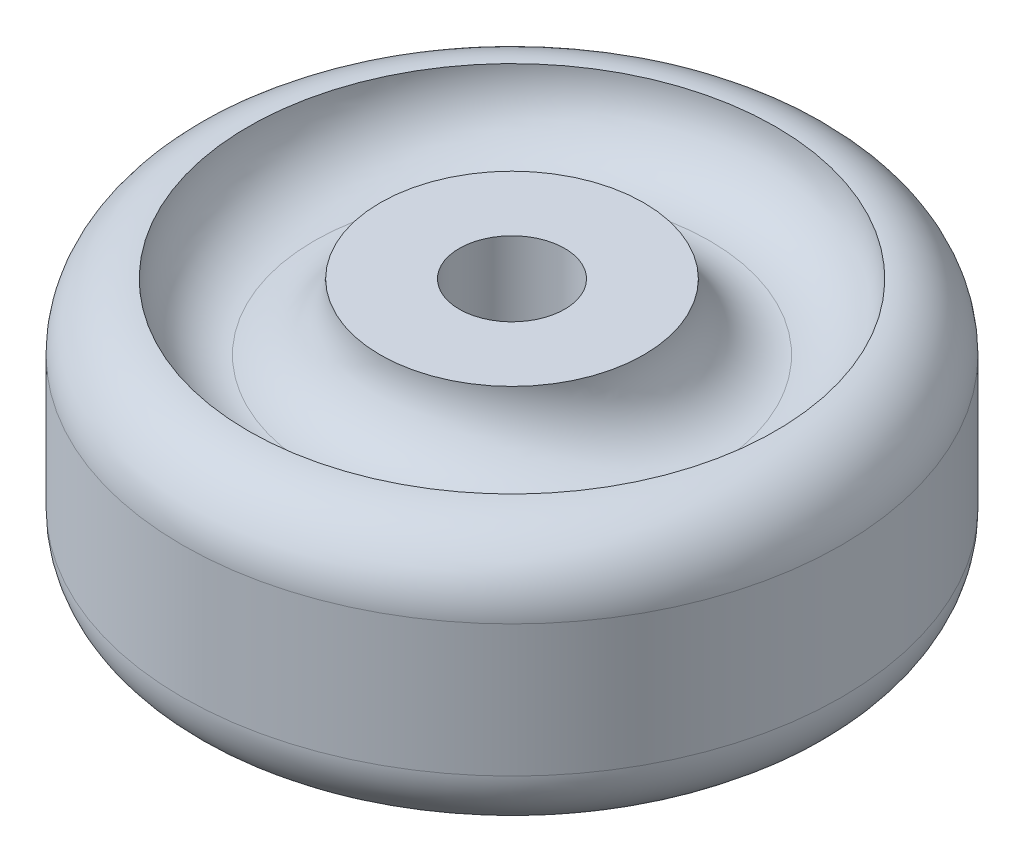
ISO-10303-21;
HEADER;
FILE_DESCRIPTION(('STEP AP214'),'2;1');
FILE_NAME('part.step','',(''),(''),'','','');
FILE_SCHEMA(('AUTOMOTIVE_DESIGN { 1 0 10303 214 1 1 1 1 }'));
ENDSEC;
DATA;
#1=APPLICATION_CONTEXT('core data for automotive mechanical design processes');
#2=APPLICATION_PROTOCOL_DEFINITION('international standard','automotive_design',2000,#1);
#3=PRODUCT_CONTEXT('',#1,'mechanical');
#4=PRODUCT('Part','Part','',(#3));
#5=PRODUCT_RELATED_PRODUCT_CATEGORY('part','',(#4));
#6=PRODUCT_DEFINITION_FORMATION('','',#4);
#7=PRODUCT_DEFINITION_CONTEXT('part definition',#1,'design');
#8=PRODUCT_DEFINITION('design','',#6,#7);
#9=PRODUCT_DEFINITION_SHAPE('','',#8);
#10=(LENGTH_UNIT() NAMED_UNIT(*) SI_UNIT(.MILLI.,.METRE.));
#11=(NAMED_UNIT(*) PLANE_ANGLE_UNIT() SI_UNIT($,.RADIAN.));
#12=(NAMED_UNIT(*) SI_UNIT($,.STERADIAN.) SOLID_ANGLE_UNIT());
#13=UNCERTAINTY_MEASURE_WITH_UNIT(LENGTH_MEASURE(1.E-05),#10,'distance_accuracy_value','');
#14=(GEOMETRIC_REPRESENTATION_CONTEXT(3) GLOBAL_UNCERTAINTY_ASSIGNED_CONTEXT((#13)) GLOBAL_UNIT_ASSIGNED_CONTEXT((#10,
#11,#12)) REPRESENTATION_CONTEXT('',''));
#15=CARTESIAN_POINT('',(0.,0.,0.));
#16=DIRECTION('',(0.,0.,1.));
#17=DIRECTION('',(1.,0.,0.));
#18=AXIS2_PLACEMENT_3D('',#15,#16,#17);
#19=CARTESIAN_POINT('',(0.,10.,0.));
#20=DIRECTION('',(0.,-1.,0.));
#21=DIRECTION('',(0.,0.,-1.));
#22=AXIS2_PLACEMENT_3D('',#19,#20,#21);
#23=CYLINDRICAL_SURFACE('',#22,25.);
#24=CARTESIAN_POINT('',(0.,-5.,0.));
#25=DIRECTION('',(0.,-1.,0.));
#26=DIRECTION('',(0.,0.,-1.));
#27=AXIS2_PLACEMENT_3D('',#24,#25,#26);
#28=CIRCLE('',#27,25.);
#29=CARTESIAN_POINT('',(0.,-5.,-25.));
#30=VERTEX_POINT('',#29);
#31=EDGE_CURVE('E10',#30,#30,#28,.F.);
#32=ORIENTED_EDGE('',*,*,#31,.T.);
#33=EDGE_LOOP('',(#32));
#34=FACE_BOUND('',#33,.T.);
#35=CARTESIAN_POINT('',(0.,5.,0.));
#36=DIRECTION('',(0.,1.,0.));
#37=DIRECTION('',(0.,0.,1.));
#38=AXIS2_PLACEMENT_3D('',#35,#36,#37);
#39=CIRCLE('',#38,25.);
#40=CARTESIAN_POINT('',(0.,5.,25.));
#41=VERTEX_POINT('',#40);
#42=EDGE_CURVE('E43',#41,#41,#39,.F.);
#43=ORIENTED_EDGE('',*,*,#42,.T.);
#44=EDGE_LOOP('',(#43));
#45=FACE_BOUND('',#44,.T.);
#46=ADVANCED_FACE('F36',(#34,#45),#23,.T.);
#47=CARTESIAN_POINT('',(0.,10.,0.));
#48=DIRECTION('',(0.,1.,0.));
#49=DIRECTION('',(0.,0.,1.));
#50=AXIS2_PLACEMENT_3D('',#47,#48,#49);
#51=PLANE('',#50);
#52=CARTESIAN_POINT('',(0.,10.,0.));
#53=DIRECTION('',(0.,1.,0.));
#54=DIRECTION('',(0.,0.,1.));
#55=AXIS2_PLACEMENT_3D('',#52,#53,#54);
#56=CIRCLE('',#55,4.);
#57=CARTESIAN_POINT('',(0.,10.,4.));
#58=VERTEX_POINT('',#57);
#59=EDGE_CURVE('E56',#58,#58,#56,.T.);
#60=ORIENTED_EDGE('',*,*,#59,.F.);
#61=EDGE_LOOP('',(#60));
#62=FACE_BOUND('',#61,.T.);
#63=CARTESIAN_POINT('',(0.,10.,0.));
#64=DIRECTION('',(0.,1.,0.));
#65=DIRECTION('',(0.,0.,1.));
#66=AXIS2_PLACEMENT_3D('',#63,#64,#65);
#67=CIRCLE('',#66,10.);
#68=CARTESIAN_POINT('',(0.,10.,10.));
#69=VERTEX_POINT('',#68);
#70=EDGE_CURVE('E52',#69,#69,#67,.T.);
#71=ORIENTED_EDGE('',*,*,#70,.T.);
#72=EDGE_LOOP('',(#71));
#73=FACE_BOUND('',#72,.T.);
#74=ADVANCED_FACE('F87',(#62,#73),#51,.T.);
#75=CARTESIAN_POINT('',(0.,10.,0.));
#76=DIRECTION('',(0.,1.,0.));
#77=DIRECTION('',(0.,0.,1.));
#78=AXIS2_PLACEMENT_3D('',#75,#76,#77);
#79=TOROIDAL_SURFACE('',#78,15.,5.);
#80=ORIENTED_EDGE('',*,*,#70,.F.);
#81=EDGE_LOOP('',(#80));
#82=FACE_BOUND('',#81,.T.);
#83=CARTESIAN_POINT('',(0.,5.,0.));
#84=DIRECTION('',(0.,1.,0.));
#85=DIRECTION('',(0.,0.,1.));
#86=AXIS2_PLACEMENT_3D('',#83,#84,#85);
#87=CIRCLE('',#86,15.);
#88=CARTESIAN_POINT('',(0.,5.,15.));
#89=VERTEX_POINT('',#88);
#90=EDGE_CURVE('E116',#89,#89,#87,.F.);
#91=ORIENTED_EDGE('',*,*,#90,.F.);
#92=EDGE_LOOP('',(#91));
#93=FACE_BOUND('',#92,.T.);
#94=ADVANCED_FACE('F80',(#82,#93),#79,.F.);
#95=CARTESIAN_POINT('',(0.,10.,0.));
#96=DIRECTION('',(0.,1.,0.));
#97=DIRECTION('',(0.,0.,1.));
#98=AXIS2_PLACEMENT_3D('',#95,#96,#97);
#99=TOROIDAL_SURFACE('',#98,15.,5.);
#100=CARTESIAN_POINT('',(0.,10.,0.));
#101=DIRECTION('',(0.,1.,0.));
#102=DIRECTION('',(0.,0.,1.));
#103=AXIS2_PLACEMENT_3D('',#100,#101,#102);
#104=CIRCLE('',#103,20.);
#105=CARTESIAN_POINT('',(0.,10.,20.));
#106=VERTEX_POINT('',#105);
#107=EDGE_CURVE('E47',#106,#106,#104,.T.);
#108=ORIENTED_EDGE('',*,*,#107,.T.);
#109=EDGE_LOOP('',(#108));
#110=FACE_BOUND('',#109,.T.);
#111=ORIENTED_EDGE('',*,*,#90,.T.);
#112=EDGE_LOOP('',(#111));
#113=FACE_BOUND('',#112,.T.);
#114=ADVANCED_FACE('F71',(#110,#113),#99,.F.);
#115=CARTESIAN_POINT('',(0.,0.,0.));
#116=DIRECTION('',(0.,1.,0.));
#117=DIRECTION('',(0.,0.,1.));
#118=AXIS2_PLACEMENT_3D('',#115,#116,#117);
#119=CYLINDRICAL_SURFACE('',#118,4.);
#120=ORIENTED_EDGE('',*,*,#59,.T.);
#121=EDGE_LOOP('',(#120));
#122=FACE_BOUND('',#121,.T.);
#123=CARTESIAN_POINT('',(0.,-10.,0.));
#124=DIRECTION('',(0.,-1.,0.));
#125=DIRECTION('',(0.,0.,-1.));
#126=AXIS2_PLACEMENT_3D('',#123,#124,#125);
#127=CIRCLE('',#126,4.);
#128=CARTESIAN_POINT('',(0.,-10.,-4.));
#129=VERTEX_POINT('',#128);
#130=EDGE_CURVE('E61',#129,#129,#127,.F.);
#131=ORIENTED_EDGE('',*,*,#130,.F.);
#132=EDGE_LOOP('',(#131));
#133=FACE_BOUND('',#132,.T.);
#134=ADVANCED_FACE('F68',(#122,#133),#119,.F.);
#135=CARTESIAN_POINT('',(0.,5.,0.));
#136=DIRECTION('',(0.,1.,0.));
#137=DIRECTION('',(0.,0.,1.));
#138=AXIS2_PLACEMENT_3D('',#135,#136,#137);
#139=TOROIDAL_SURFACE('',#138,20.,5.);
#140=ORIENTED_EDGE('',*,*,#42,.F.);
#141=EDGE_LOOP('',(#140));
#142=FACE_BOUND('',#141,.T.);
#143=ORIENTED_EDGE('',*,*,#107,.F.);
#144=EDGE_LOOP('',(#143));
#145=FACE_BOUND('',#144,.T.);
#146=ADVANCED_FACE('F70',(#142,#145),#139,.T.);
#147=CARTESIAN_POINT('',(0.,-10.,0.));
#148=DIRECTION('',(0.,-1.,0.));
#149=DIRECTION('',(0.,0.,1.));
#150=AXIS2_PLACEMENT_3D('',#147,#148,#149);
#151=PLANE('',#150);
#152=ORIENTED_EDGE('',*,*,#130,.T.);
#153=EDGE_LOOP('',(#152));
#154=FACE_BOUND('',#153,.T.);
#155=CARTESIAN_POINT('',(0.,-10.,0.));
#156=DIRECTION('',(0.,1.,0.));
#157=DIRECTION('',(0.,0.,1.));
#158=AXIS2_PLACEMENT_3D('',#155,#156,#157);
#159=CIRCLE('',#158,10.);
#160=CARTESIAN_POINT('',(0.,-10.,10.));
#161=VERTEX_POINT('',#160);
#162=EDGE_CURVE('E60',#161,#161,#159,.T.);
#163=ORIENTED_EDGE('',*,*,#162,.F.);
#164=EDGE_LOOP('',(#163));
#165=FACE_BOUND('',#164,.T.);
#166=ADVANCED_FACE('F65',(#154,#165),#151,.T.);
#167=CARTESIAN_POINT('',(0.,-10.,0.));
#168=DIRECTION('',(0.,-1.,0.));
#169=DIRECTION('',(0.,0.,-1.));
#170=AXIS2_PLACEMENT_3D('',#167,#168,#169);
#171=TOROIDAL_SURFACE('',#170,15.,5.);
#172=ORIENTED_EDGE('',*,*,#162,.T.);
#173=EDGE_LOOP('',(#172));
#174=FACE_BOUND('',#173,.T.);
#175=CARTESIAN_POINT('',(0.,-5.,0.));
#176=DIRECTION('',(0.,-1.,0.));
#177=DIRECTION('',(0.,0.,-1.));
#178=AXIS2_PLACEMENT_3D('',#175,#176,#177);
#179=CIRCLE('',#178,15.);
#180=CARTESIAN_POINT('',(0.,-5.,-15.));
#181=VERTEX_POINT('',#180);
#182=EDGE_CURVE('E58',#181,#181,#179,.F.);
#183=ORIENTED_EDGE('',*,*,#182,.F.);
#184=EDGE_LOOP('',(#183));
#185=FACE_BOUND('',#184,.T.);
#186=ADVANCED_FACE('F99',(#174,#185),#171,.F.);
#187=CARTESIAN_POINT('',(0.,-10.,0.));
#188=DIRECTION('',(0.,-1.,0.));
#189=DIRECTION('',(0.,0.,-1.));
#190=AXIS2_PLACEMENT_3D('',#187,#188,#189);
#191=TOROIDAL_SURFACE('',#190,15.,5.);
#192=ORIENTED_EDGE('',*,*,#182,.T.);
#193=EDGE_LOOP('',(#192));
#194=FACE_BOUND('',#193,.T.);
#195=CARTESIAN_POINT('',(0.,-10.,0.));
#196=DIRECTION('',(0.,1.,0.));
#197=DIRECTION('',(0.,0.,1.));
#198=AXIS2_PLACEMENT_3D('',#195,#196,#197);
#199=CIRCLE('',#198,20.);
#200=CARTESIAN_POINT('',(0.,-10.,20.));
#201=VERTEX_POINT('',#200);
#202=EDGE_CURVE('E113',#201,#201,#199,.T.);
#203=ORIENTED_EDGE('',*,*,#202,.F.);
#204=EDGE_LOOP('',(#203));
#205=FACE_BOUND('',#204,.T.);
#206=ADVANCED_FACE('F97',(#194,#205),#191,.F.);
#207=CARTESIAN_POINT('',(0.,-5.,0.));
#208=DIRECTION('',(0.,-1.,0.));
#209=DIRECTION('',(0.,0.,-1.));
#210=AXIS2_PLACEMENT_3D('',#207,#208,#209);
#211=TOROIDAL_SURFACE('',#210,20.,5.);
#212=ORIENTED_EDGE('',*,*,#202,.T.);
#213=EDGE_LOOP('',(#212));
#214=FACE_BOUND('',#213,.T.);
#215=ORIENTED_EDGE('',*,*,#31,.F.);
#216=EDGE_LOOP('',(#215));
#217=FACE_BOUND('',#216,.T.);
#218=ADVANCED_FACE('F38',(#214,#217),#211,.T.);
#219=CLOSED_SHELL('',(#46,#74,#94,#114,#134,#146,#166,#186,#206,#218));
#220=MANIFOLD_SOLID_BREP('B2',#219);
#221=ADVANCED_BREP_SHAPE_REPRESENTATION('',(#18,#220),#14);
#222=SHAPE_DEFINITION_REPRESENTATION(#9,#221);
ENDSEC;
END-ISO-10303-21;
